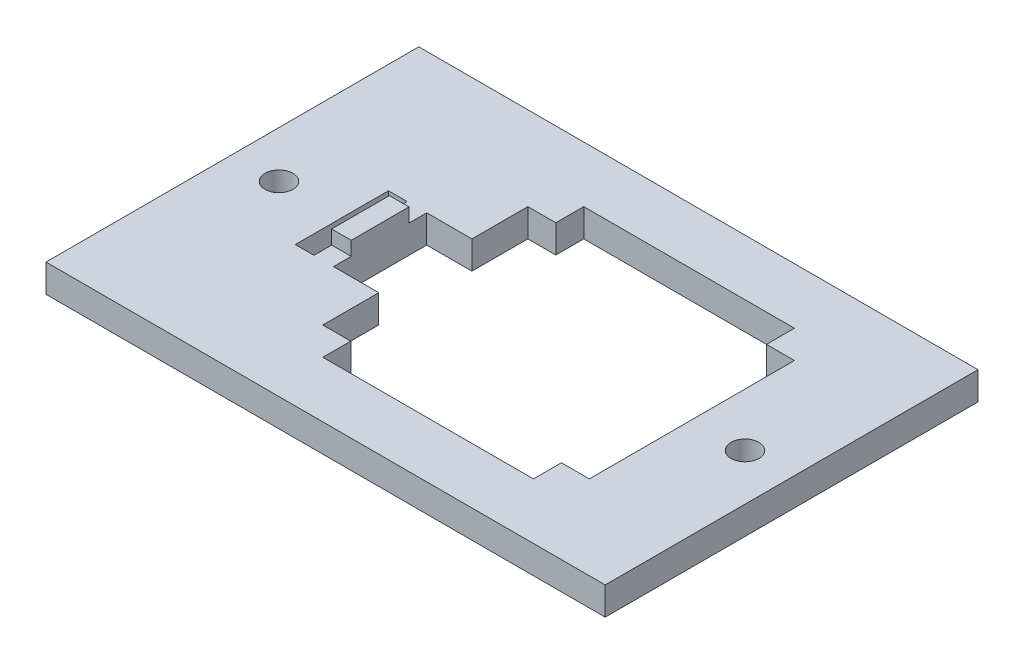
ISO-10303-21;
HEADER;
FILE_DESCRIPTION(('STEP AP214'),'2;1');
FILE_NAME('part.step','',(''),(''),'','','');
FILE_SCHEMA(('AUTOMOTIVE_DESIGN { 1 0 10303 214 1 1 1 1 }'));
ENDSEC;
DATA;
#1=APPLICATION_CONTEXT('core data for automotive mechanical design processes');
#2=APPLICATION_PROTOCOL_DEFINITION('international standard','automotive_design',2000,#1);
#3=PRODUCT_CONTEXT('',#1,'mechanical');
#4=PRODUCT('Part','Part','',(#3));
#5=PRODUCT_RELATED_PRODUCT_CATEGORY('part','',(#4));
#6=PRODUCT_DEFINITION_FORMATION('','',#4);
#7=PRODUCT_DEFINITION_CONTEXT('part definition',#1,'design');
#8=PRODUCT_DEFINITION('design','',#6,#7);
#9=PRODUCT_DEFINITION_SHAPE('','',#8);
#10=(LENGTH_UNIT() NAMED_UNIT(*) SI_UNIT(.MILLI.,.METRE.));
#11=(NAMED_UNIT(*) PLANE_ANGLE_UNIT() SI_UNIT($,.RADIAN.));
#12=(NAMED_UNIT(*) SI_UNIT($,.STERADIAN.) SOLID_ANGLE_UNIT());
#13=UNCERTAINTY_MEASURE_WITH_UNIT(LENGTH_MEASURE(1.E-05),#10,'distance_accuracy_value','');
#14=(GEOMETRIC_REPRESENTATION_CONTEXT(3) GLOBAL_UNCERTAINTY_ASSIGNED_CONTEXT((#13)) GLOBAL_UNIT_ASSIGNED_CONTEXT((#10,
#11,#12)) REPRESENTATION_CONTEXT('',''));
#15=CARTESIAN_POINT('',(0.,0.,0.));
#16=DIRECTION('',(0.,0.,1.));
#17=DIRECTION('',(1.,0.,0.));
#18=AXIS2_PLACEMENT_3D('',#15,#16,#17);
#19=CARTESIAN_POINT('',(-9.3,-0.00100000000000013,14.));
#20=DIRECTION('',(-1.,0.,0.));
#21=DIRECTION('',(0.,0.,1.));
#22=AXIS2_PLACEMENT_3D('',#19,#20,#21);
#23=PLANE('',#22);
#24=DIRECTION('',(0.,1.,0.));
#25=VECTOR('',#24,1.);
#26=CARTESIAN_POINT('',(-9.3,-0.00100000000000187,-5.));
#27=LINE('',#26,#25);
#28=CARTESIAN_POINT('',(-9.3,0.,-5.));
#29=VERTEX_POINT('',#28);
#30=CARTESIAN_POINT('',(-9.3,3.,-5.));
#31=VERTEX_POINT('',#30);
#32=EDGE_CURVE('E275',#29,#31,#27,.T.);
#33=ORIENTED_EDGE('',*,*,#32,.F.);
#34=DIRECTION('',(0.,0.,-1.));
#35=VECTOR('',#34,1.);
#36=CARTESIAN_POINT('',(-9.3,0.,14.));
#37=LINE('',#36,#35);
#38=CARTESIAN_POINT('',(-9.3,0.,-11.));
#39=VERTEX_POINT('',#38);
#40=EDGE_CURVE('E397',#29,#39,#37,.T.);
#41=ORIENTED_EDGE('',*,*,#40,.T.);
#42=DIRECTION('',(0.,1.,0.));
#43=VECTOR('',#42,1.);
#44=CARTESIAN_POINT('',(-9.3,-4.24264068711929,-11.));
#45=LINE('',#44,#43);
#46=CARTESIAN_POINT('',(-9.3,3.,-11.));
#47=VERTEX_POINT('',#46);
#48=EDGE_CURVE('E375',#39,#47,#45,.T.);
#49=ORIENTED_EDGE('',*,*,#48,.T.);
#50=DIRECTION('',(0.,0.,1.));
#51=VECTOR('',#50,1.);
#52=CARTESIAN_POINT('',(-9.3,3.,14.));
#53=LINE('',#52,#51);
#54=EDGE_CURVE('E402',#47,#31,#53,.T.);
#55=ORIENTED_EDGE('',*,*,#54,.T.);
#56=EDGE_LOOP('',(#33,#41,#49,#55));
#57=FACE_BOUND('',#56,.T.);
#58=ADVANCED_FACE('F39',(#57),#23,.F.);
#59=CARTESIAN_POINT('',(0.,0.,0.));
#60=DIRECTION('',(0.,1.,0.));
#61=DIRECTION('',(0.,0.,1.));
#62=AXIS2_PLACEMENT_3D('',#59,#60,#61);
#63=PLANE('',#62);
#64=DIRECTION('',(0.,0.,1.));
#65=VECTOR('',#64,1.);
#66=CARTESIAN_POINT('',(-30.,0.,20.));
#67=LINE('',#66,#65);
#68=CARTESIAN_POINT('',(-30.,0.,-20.));
#69=VERTEX_POINT('',#68);
#70=CARTESIAN_POINT('',(-30.,0.,20.));
#71=VERTEX_POINT('',#70);
#72=EDGE_CURVE('E414',#69,#71,#67,.T.);
#73=ORIENTED_EDGE('',*,*,#72,.F.);
#74=DIRECTION('',(-1.,0.,0.));
#75=VECTOR('',#74,1.);
#76=CARTESIAN_POINT('',(30.,0.,-20.));
#77=LINE('',#76,#75);
#78=CARTESIAN_POINT('',(30.,0.,-20.));
#79=VERTEX_POINT('',#78);
#80=EDGE_CURVE('E416',#79,#69,#77,.T.);
#81=ORIENTED_EDGE('',*,*,#80,.F.);
#82=DIRECTION('',(0.,0.,-1.));
#83=VECTOR('',#82,1.);
#84=CARTESIAN_POINT('',(30.,0.,20.));
#85=LINE('',#84,#83);
#86=CARTESIAN_POINT('',(30.,0.,20.));
#87=VERTEX_POINT('',#86);
#88=EDGE_CURVE('E427',#87,#79,#85,.T.);
#89=ORIENTED_EDGE('',*,*,#88,.F.);
#90=DIRECTION('',(1.,0.,0.));
#91=VECTOR('',#90,1.);
#92=CARTESIAN_POINT('',(30.,0.,20.));
#93=LINE('',#92,#91);
#94=EDGE_CURVE('E430',#71,#87,#93,.T.);
#95=ORIENTED_EDGE('',*,*,#94,.F.);
#96=EDGE_LOOP('',(#73,#81,#89,#95));
#97=FACE_BOUND('',#96,.T.);
#98=CARTESIAN_POINT('',(-25.,0.,0.));
#99=DIRECTION('',(0.,1.,0.));
#100=DIRECTION('',(0.,0.,1.));
#101=AXIS2_PLACEMENT_3D('',#98,#99,#100);
#102=CIRCLE('',#101,1.5);
#103=CARTESIAN_POINT('',(-25.,0.,1.5));
#104=VERTEX_POINT('',#103);
#105=EDGE_CURVE('E379',#104,#104,#102,.F.);
#106=ORIENTED_EDGE('',*,*,#105,.F.);
#107=EDGE_LOOP('',(#106));
#108=FACE_BOUND('',#107,.T.);
#109=CARTESIAN_POINT('',(25.,0.,0.));
#110=DIRECTION('',(0.,1.,0.));
#111=DIRECTION('',(0.,0.,1.));
#112=AXIS2_PLACEMENT_3D('',#109,#110,#111);
#113=CIRCLE('',#112,1.5);
#114=CARTESIAN_POINT('',(25.,0.,1.5));
#115=VERTEX_POINT('',#114);
#116=EDGE_CURVE('E383',#115,#115,#113,.F.);
#117=ORIENTED_EDGE('',*,*,#116,.F.);
#118=EDGE_LOOP('',(#117));
#119=FACE_BOUND('',#118,.T.);
#120=DIRECTION('',(0.,0.,1.));
#121=VECTOR('',#120,1.);
#122=CARTESIAN_POINT('',(-16.25,0.,-5.));
#123=LINE('',#122,#121);
#124=CARTESIAN_POINT('',(-16.25,0.,-5.));
#125=VERTEX_POINT('',#124);
#126=CARTESIAN_POINT('',(-16.25,0.,5.));
#127=VERTEX_POINT('',#126);
#128=EDGE_CURVE('E308',#125,#127,#123,.T.);
#129=ORIENTED_EDGE('',*,*,#128,.F.);
#130=DIRECTION('',(1.,0.,0.));
#131=VECTOR('',#130,1.);
#132=CARTESIAN_POINT('',(-16.25,0.,-5.));
#133=LINE('',#132,#131);
#134=CARTESIAN_POINT('',(-18.25,0.,-5.));
#135=VERTEX_POINT('',#134);
#136=EDGE_CURVE('E304',#135,#125,#133,.T.);
#137=ORIENTED_EDGE('',*,*,#136,.F.);
#138=DIRECTION('',(0.,0.,-1.));
#139=VECTOR('',#138,1.);
#140=CARTESIAN_POINT('',(-18.25,0.,5.));
#141=LINE('',#140,#139);
#142=CARTESIAN_POINT('',(-18.25,0.,5.));
#143=VERTEX_POINT('',#142);
#144=EDGE_CURVE('E249',#143,#135,#141,.T.);
#145=ORIENTED_EDGE('',*,*,#144,.F.);
#146=DIRECTION('',(-1.,0.,0.));
#147=VECTOR('',#146,1.);
#148=CARTESIAN_POINT('',(-16.25,0.,5.));
#149=LINE('',#148,#147);
#150=EDGE_CURVE('E261',#127,#143,#149,.T.);
#151=ORIENTED_EDGE('',*,*,#150,.F.);
#152=EDGE_LOOP('',(#129,#137,#145,#151));
#153=FACE_BOUND('',#152,.T.);
#154=DIRECTION('',(-1.,0.,0.));
#155=VECTOR('',#154,1.);
#156=CARTESIAN_POINT('',(-9.3,0.,5.));
#157=LINE('',#156,#155);
#158=CARTESIAN_POINT('',(-9.3,0.,5.));
#159=VERTEX_POINT('',#158);
#160=CARTESIAN_POINT('',(-14.15,0.,5.));
#161=VERTEX_POINT('',#160);
#162=EDGE_CURVE('E257',#159,#161,#157,.T.);
#163=ORIENTED_EDGE('',*,*,#162,.F.);
#164=CARTESIAN_POINT('',(-9.3,0.,11.));
#165=VERTEX_POINT('',#164);
#166=EDGE_CURVE('E400',#165,#159,#37,.T.);
#167=ORIENTED_EDGE('',*,*,#166,.F.);
#168=DIRECTION('',(1.,0.,0.));
#169=VECTOR('',#168,1.);
#170=CARTESIAN_POINT('',(-9.3,0.,11.));
#171=LINE('',#170,#169);
#172=CARTESIAN_POINT('',(-6.3,0.,11.));
#173=VERTEX_POINT('',#172);
#174=EDGE_CURVE('E324',#165,#173,#171,.T.);
#175=ORIENTED_EDGE('',*,*,#174,.T.);
#176=DIRECTION('',(0.,0.,1.));
#177=VECTOR('',#176,1.);
#178=CARTESIAN_POINT('',(-6.3,0.,14.));
#179=LINE('',#178,#177);
#180=CARTESIAN_POINT('',(-6.3,0.,14.));
#181=VERTEX_POINT('',#180);
#182=EDGE_CURVE('E318',#173,#181,#179,.T.);
#183=ORIENTED_EDGE('',*,*,#182,.T.);
#184=DIRECTION('',(-1.,0.,0.));
#185=VECTOR('',#184,1.);
#186=CARTESIAN_POINT('',(19.3,0.,14.));
#187=LINE('',#186,#185);
#188=CARTESIAN_POINT('',(16.3,0.,14.));
#189=VERTEX_POINT('',#188);
#190=EDGE_CURVE('E409',#189,#181,#187,.T.);
#191=ORIENTED_EDGE('',*,*,#190,.F.);
#192=DIRECTION('',(0.,0.,-1.));
#193=VECTOR('',#192,1.);
#194=CARTESIAN_POINT('',(16.3,0.,14.));
#195=LINE('',#194,#193);
#196=CARTESIAN_POINT('',(16.3,0.,11.));
#197=VERTEX_POINT('',#196);
#198=EDGE_CURVE('E335',#189,#197,#195,.T.);
#199=ORIENTED_EDGE('',*,*,#198,.T.);
#200=DIRECTION('',(1.,0.,0.));
#201=VECTOR('',#200,1.);
#202=CARTESIAN_POINT('',(19.3,0.,11.));
#203=LINE('',#202,#201);
#204=CARTESIAN_POINT('',(19.3,0.,11.));
#205=VERTEX_POINT('',#204);
#206=EDGE_CURVE('E328',#197,#205,#203,.T.);
#207=ORIENTED_EDGE('',*,*,#206,.T.);
#208=DIRECTION('',(0.,0.,1.));
#209=VECTOR('',#208,1.);
#210=CARTESIAN_POINT('',(19.3,0.,14.));
#211=LINE('',#210,#209);
#212=CARTESIAN_POINT('',(19.3,0.,-11.));
#213=VERTEX_POINT('',#212);
#214=EDGE_CURVE('E389',#213,#205,#211,.T.);
#215=ORIENTED_EDGE('',*,*,#214,.F.);
#216=DIRECTION('',(-1.,0.,0.));
#217=VECTOR('',#216,1.);
#218=CARTESIAN_POINT('',(19.3,0.,-11.));
#219=LINE('',#218,#217);
#220=CARTESIAN_POINT('',(16.3,0.,-11.));
#221=VERTEX_POINT('',#220);
#222=EDGE_CURVE('E282',#213,#221,#219,.T.);
#223=ORIENTED_EDGE('',*,*,#222,.T.);
#224=DIRECTION('',(0.,0.,-1.));
#225=VECTOR('',#224,1.);
#226=CARTESIAN_POINT('',(16.3,0.,-14.));
#227=LINE('',#226,#225);
#228=CARTESIAN_POINT('',(16.3,0.,-14.));
#229=VERTEX_POINT('',#228);
#230=EDGE_CURVE('E354',#221,#229,#227,.T.);
#231=ORIENTED_EDGE('',*,*,#230,.T.);
#232=DIRECTION('',(1.,0.,0.));
#233=VECTOR('',#232,1.);
#234=CARTESIAN_POINT('',(19.3,0.,-14.));
#235=LINE('',#234,#233);
#236=CARTESIAN_POINT('',(-6.3,0.,-14.));
#237=VERTEX_POINT('',#236);
#238=EDGE_CURVE('E393',#237,#229,#235,.T.);
#239=ORIENTED_EDGE('',*,*,#238,.F.);
#240=DIRECTION('',(0.,0.,1.));
#241=VECTOR('',#240,1.);
#242=CARTESIAN_POINT('',(-6.3,0.,-14.));
#243=LINE('',#242,#241);
#244=CARTESIAN_POINT('',(-6.3,0.,-11.));
#245=VERTEX_POINT('',#244);
#246=EDGE_CURVE('E361',#237,#245,#243,.T.);
#247=ORIENTED_EDGE('',*,*,#246,.T.);
#248=DIRECTION('',(-1.,0.,0.));
#249=VECTOR('',#248,1.);
#250=CARTESIAN_POINT('',(-9.3,0.,-11.));
#251=LINE('',#250,#249);
#252=EDGE_CURVE('E364',#245,#39,#251,.T.);
#253=ORIENTED_EDGE('',*,*,#252,.T.);
#254=ORIENTED_EDGE('',*,*,#40,.F.);
#255=DIRECTION('',(1.,0.,0.));
#256=VECTOR('',#255,1.);
#257=CARTESIAN_POINT('',(-9.3,0.,-5.));
#258=LINE('',#257,#256);
#259=CARTESIAN_POINT('',(-14.15,0.,-5.));
#260=VERTEX_POINT('',#259);
#261=EDGE_CURVE('E277',#260,#29,#258,.T.);
#262=ORIENTED_EDGE('',*,*,#261,.F.);
#263=DIRECTION('',(0.,0.,-1.));
#264=VECTOR('',#263,1.);
#265=CARTESIAN_POINT('',(-14.15,0.,-5.));
#266=LINE('',#265,#264);
#267=EDGE_CURVE('E260',#161,#260,#266,.T.);
#268=ORIENTED_EDGE('',*,*,#267,.F.);
#269=EDGE_LOOP('',(#163,#167,#175,#183,#191,#199,#207,#215,#223,#231,#239,#247,#253,#254,#262,#268));
#270=FACE_BOUND('',#269,.T.);
#271=ADVANCED_FACE('F450',(#97,#108,#119,#153,#270),#63,.F.);
#272=ORIENTED_EDGE('',*,*,#166,.T.);
#273=DIRECTION('',(0.,1.,0.));
#274=VECTOR('',#273,1.);
#275=CARTESIAN_POINT('',(-9.3,-0.00100000000000187,5.));
#276=LINE('',#275,#274);
#277=CARTESIAN_POINT('',(-9.3,3.,5.));
#278=VERTEX_POINT('',#277);
#279=EDGE_CURVE('E272',#159,#278,#276,.T.);
#280=ORIENTED_EDGE('',*,*,#279,.T.);
#281=CARTESIAN_POINT('',(-9.3,3.,11.));
#282=VERTEX_POINT('',#281);
#283=EDGE_CURVE('E398',#278,#282,#53,.T.);
#284=ORIENTED_EDGE('',*,*,#283,.T.);
#285=DIRECTION('',(0.,1.,0.));
#286=VECTOR('',#285,1.);
#287=CARTESIAN_POINT('',(-9.3,-4.24264068711929,11.));
#288=LINE('',#287,#286);
#289=EDGE_CURVE('E312',#165,#282,#288,.T.);
#290=ORIENTED_EDGE('',*,*,#289,.F.);
#291=EDGE_LOOP('',(#272,#280,#284,#290));
#292=FACE_BOUND('',#291,.T.);
#293=ADVANCED_FACE('F466',(#292),#23,.F.);
#294=CARTESIAN_POINT('',(19.3,-0.00100000000000013,-14.));
#295=DIRECTION('',(0.,0.,-1.));
#296=DIRECTION('',(-1.,0.,0.));
#297=AXIS2_PLACEMENT_3D('',#294,#295,#296);
#298=PLANE('',#297);
#299=ORIENTED_EDGE('',*,*,#238,.T.);
#300=DIRECTION('',(0.,1.,0.));
#301=VECTOR('',#300,1.);
#302=CARTESIAN_POINT('',(16.3,-4.24264068711929,-14.));
#303=LINE('',#302,#301);
#304=CARTESIAN_POINT('',(16.3,3.,-14.));
#305=VERTEX_POINT('',#304);
#306=EDGE_CURVE('E350',#229,#305,#303,.T.);
#307=ORIENTED_EDGE('',*,*,#306,.T.);
#308=DIRECTION('',(-1.,0.,0.));
#309=VECTOR('',#308,1.);
#310=CARTESIAN_POINT('',(19.3,3.,-14.));
#311=LINE('',#310,#309);
#312=CARTESIAN_POINT('',(-6.3,3.,-14.));
#313=VERTEX_POINT('',#312);
#314=EDGE_CURVE('E407',#305,#313,#311,.T.);
#315=ORIENTED_EDGE('',*,*,#314,.T.);
#316=DIRECTION('',(0.,1.,0.));
#317=VECTOR('',#316,1.);
#318=CARTESIAN_POINT('',(-6.3,-4.24264068711929,-14.));
#319=LINE('',#318,#317);
#320=EDGE_CURVE('E368',#237,#313,#319,.T.);
#321=ORIENTED_EDGE('',*,*,#320,.F.);
#322=EDGE_LOOP('',(#299,#307,#315,#321));
#323=FACE_BOUND('',#322,.T.);
#324=ADVANCED_FACE('F479',(#323),#298,.F.);
#325=CARTESIAN_POINT('',(19.3,-0.00100000000000013,14.));
#326=DIRECTION('',(1.,0.,0.));
#327=DIRECTION('',(0.,0.,-1.));
#328=AXIS2_PLACEMENT_3D('',#325,#326,#327);
#329=PLANE('',#328);
#330=DIRECTION('',(0.,1.,0.));
#331=VECTOR('',#330,1.);
#332=CARTESIAN_POINT('',(19.3,-4.24264068711929,-11.));
#333=LINE('',#332,#331);
#334=CARTESIAN_POINT('',(19.3,3.,-11.));
#335=VERTEX_POINT('',#334);
#336=EDGE_CURVE('E355',#213,#335,#333,.T.);
#337=ORIENTED_EDGE('',*,*,#336,.F.);
#338=ORIENTED_EDGE('',*,*,#214,.T.);
#339=DIRECTION('',(0.,1.,0.));
#340=VECTOR('',#339,1.);
#341=CARTESIAN_POINT('',(19.3,-4.24264068711929,11.));
#342=LINE('',#341,#340);
#343=CARTESIAN_POINT('',(19.3,3.,11.));
#344=VERTEX_POINT('',#343);
#345=EDGE_CURVE('E331',#205,#344,#342,.T.);
#346=ORIENTED_EDGE('',*,*,#345,.T.);
#347=DIRECTION('',(0.,0.,-1.));
#348=VECTOR('',#347,1.);
#349=CARTESIAN_POINT('',(19.3,3.,14.));
#350=LINE('',#349,#348);
#351=EDGE_CURVE('E406',#344,#335,#350,.T.);
#352=ORIENTED_EDGE('',*,*,#351,.T.);
#353=EDGE_LOOP('',(#337,#338,#346,#352));
#354=FACE_BOUND('',#353,.T.);
#355=ADVANCED_FACE('F484',(#354),#329,.F.);
#356=CARTESIAN_POINT('',(19.3,-0.00100000000000013,14.));
#357=DIRECTION('',(0.,0.,1.));
#358=DIRECTION('',(1.,0.,0.));
#359=AXIS2_PLACEMENT_3D('',#356,#357,#358);
#360=PLANE('',#359);
#361=DIRECTION('',(0.,1.,0.));
#362=VECTOR('',#361,1.);
#363=CARTESIAN_POINT('',(16.3,-4.24264068711929,14.));
#364=LINE('',#363,#362);
#365=CARTESIAN_POINT('',(16.3,3.,14.));
#366=VERTEX_POINT('',#365);
#367=EDGE_CURVE('E338',#189,#366,#364,.T.);
#368=ORIENTED_EDGE('',*,*,#367,.F.);
#369=ORIENTED_EDGE('',*,*,#190,.T.);
#370=DIRECTION('',(0.,1.,0.));
#371=VECTOR('',#370,1.);
#372=CARTESIAN_POINT('',(-6.3,-4.24264068711929,14.));
#373=LINE('',#372,#371);
#374=CARTESIAN_POINT('',(-6.3,3.,14.));
#375=VERTEX_POINT('',#374);
#376=EDGE_CURVE('E310',#181,#375,#373,.T.);
#377=ORIENTED_EDGE('',*,*,#376,.T.);
#378=DIRECTION('',(1.,0.,0.));
#379=VECTOR('',#378,1.);
#380=CARTESIAN_POINT('',(19.3,3.,14.));
#381=LINE('',#380,#379);
#382=EDGE_CURVE('E404',#375,#366,#381,.T.);
#383=ORIENTED_EDGE('',*,*,#382,.T.);
#384=EDGE_LOOP('',(#368,#369,#377,#383));
#385=FACE_BOUND('',#384,.T.);
#386=ADVANCED_FACE('F464',(#385),#360,.F.);
#387=CARTESIAN_POINT('',(-30.,3.,20.));
#388=DIRECTION('',(1.,0.,0.));
#389=DIRECTION('',(0.,0.,-1.));
#390=AXIS2_PLACEMENT_3D('',#387,#388,#389);
#391=PLANE('',#390);
#392=ORIENTED_EDGE('',*,*,#72,.T.);
#393=DIRECTION('',(0.,-1.,0.));
#394=VECTOR('',#393,1.);
#395=CARTESIAN_POINT('',(-30.,3.,20.));
#396=LINE('',#395,#394);
#397=CARTESIAN_POINT('',(-30.,3.,20.));
#398=VERTEX_POINT('',#397);
#399=EDGE_CURVE('E11',#398,#71,#396,.T.);
#400=ORIENTED_EDGE('',*,*,#399,.F.);
#401=DIRECTION('',(0.,0.,1.));
#402=VECTOR('',#401,1.);
#403=CARTESIAN_POINT('',(-30.,3.,20.));
#404=LINE('',#403,#402);
#405=CARTESIAN_POINT('',(-30.,3.,-20.));
#406=VERTEX_POINT('',#405);
#407=EDGE_CURVE('E411',#406,#398,#404,.T.);
#408=ORIENTED_EDGE('',*,*,#407,.F.);
#409=DIRECTION('',(0.,-1.,0.));
#410=VECTOR('',#409,1.);
#411=CARTESIAN_POINT('',(-30.,3.,-20.));
#412=LINE('',#411,#410);
#413=EDGE_CURVE('E424',#406,#69,#412,.T.);
#414=ORIENTED_EDGE('',*,*,#413,.T.);
#415=EDGE_LOOP('',(#392,#400,#408,#414));
#416=FACE_BOUND('',#415,.T.);
#417=ADVANCED_FACE('F41',(#416),#391,.F.);
#418=CARTESIAN_POINT('',(30.,3.,20.));
#419=DIRECTION('',(0.,0.,-1.));
#420=DIRECTION('',(-1.,0.,0.));
#421=AXIS2_PLACEMENT_3D('',#418,#419,#420);
#422=PLANE('',#421);
#423=ORIENTED_EDGE('',*,*,#94,.T.);
#424=DIRECTION('',(0.,-1.,0.));
#425=VECTOR('',#424,1.);
#426=CARTESIAN_POINT('',(30.,3.,20.));
#427=LINE('',#426,#425);
#428=CARTESIAN_POINT('',(30.,3.,20.));
#429=VERTEX_POINT('',#428);
#430=EDGE_CURVE('E50',#429,#87,#427,.T.);
#431=ORIENTED_EDGE('',*,*,#430,.F.);
#432=DIRECTION('',(1.,0.,0.));
#433=VECTOR('',#432,1.);
#434=CARTESIAN_POINT('',(30.,3.,20.));
#435=LINE('',#434,#433);
#436=EDGE_CURVE('E417',#398,#429,#435,.T.);
#437=ORIENTED_EDGE('',*,*,#436,.F.);
#438=ORIENTED_EDGE('',*,*,#399,.T.);
#439=EDGE_LOOP('',(#423,#431,#437,#438));
#440=FACE_BOUND('',#439,.T.);
#441=ADVANCED_FACE('F456',(#440),#422,.F.);
#442=CARTESIAN_POINT('',(30.,3.,20.));
#443=DIRECTION('',(-1.,0.,0.));
#444=DIRECTION('',(0.,0.,1.));
#445=AXIS2_PLACEMENT_3D('',#442,#443,#444);
#446=PLANE('',#445);
#447=ORIENTED_EDGE('',*,*,#88,.T.);
#448=DIRECTION('',(0.,-1.,0.));
#449=VECTOR('',#448,1.);
#450=CARTESIAN_POINT('',(30.,3.,-20.));
#451=LINE('',#450,#449);
#452=CARTESIAN_POINT('',(30.,3.,-20.));
#453=VERTEX_POINT('',#452);
#454=EDGE_CURVE('E432',#453,#79,#451,.T.);
#455=ORIENTED_EDGE('',*,*,#454,.F.);
#456=DIRECTION('',(0.,0.,-1.));
#457=VECTOR('',#456,1.);
#458=CARTESIAN_POINT('',(30.,3.,20.));
#459=LINE('',#458,#457);
#460=EDGE_CURVE('E419',#429,#453,#459,.T.);
#461=ORIENTED_EDGE('',*,*,#460,.F.);
#462=ORIENTED_EDGE('',*,*,#430,.T.);
#463=EDGE_LOOP('',(#447,#455,#461,#462));
#464=FACE_BOUND('',#463,.T.);
#465=ADVANCED_FACE('F442',(#464),#446,.F.);
#466=CARTESIAN_POINT('',(30.,3.,-20.));
#467=DIRECTION('',(0.,0.,1.));
#468=DIRECTION('',(1.,0.,0.));
#469=AXIS2_PLACEMENT_3D('',#466,#467,#468);
#470=PLANE('',#469);
#471=ORIENTED_EDGE('',*,*,#80,.T.);
#472=ORIENTED_EDGE('',*,*,#413,.F.);
#473=DIRECTION('',(-1.,0.,0.));
#474=VECTOR('',#473,1.);
#475=CARTESIAN_POINT('',(30.,3.,-20.));
#476=LINE('',#475,#474);
#477=EDGE_CURVE('E425',#453,#406,#476,.T.);
#478=ORIENTED_EDGE('',*,*,#477,.F.);
#479=ORIENTED_EDGE('',*,*,#454,.T.);
#480=EDGE_LOOP('',(#471,#472,#478,#479));
#481=FACE_BOUND('',#480,.T.);
#482=ADVANCED_FACE('F452',(#481),#470,.F.);
#483=CARTESIAN_POINT('',(0.,3.,0.));
#484=DIRECTION('',(0.,1.,0.));
#485=DIRECTION('',(0.,0.,1.));
#486=AXIS2_PLACEMENT_3D('',#483,#484,#485);
#487=PLANE('',#486);
#488=DIRECTION('',(-1.,0.,0.));
#489=VECTOR('',#488,1.);
#490=CARTESIAN_POINT('',(-16.25,3.,-3.1));
#491=LINE('',#490,#489);
#492=CARTESIAN_POINT('',(-14.15,3.,-3.1));
#493=VERTEX_POINT('',#492);
#494=CARTESIAN_POINT('',(-16.25,3.,-3.1));
#495=VERTEX_POINT('',#494);
#496=EDGE_CURVE('E242',#493,#495,#491,.T.);
#497=ORIENTED_EDGE('',*,*,#496,.F.);
#498=DIRECTION('',(0.,0.,1.));
#499=VECTOR('',#498,1.);
#500=CARTESIAN_POINT('',(-14.15,3.,-5.));
#501=LINE('',#500,#499);
#502=CARTESIAN_POINT('',(-14.15,3.,-5.));
#503=VERTEX_POINT('',#502);
#504=EDGE_CURVE('E270',#503,#493,#501,.T.);
#505=ORIENTED_EDGE('',*,*,#504,.F.);
#506=DIRECTION('',(-1.,0.,0.));
#507=VECTOR('',#506,1.);
#508=CARTESIAN_POINT('',(-9.3,3.,-5.));
#509=LINE('',#508,#507);
#510=EDGE_CURVE('E263',#31,#503,#509,.T.);
#511=ORIENTED_EDGE('',*,*,#510,.F.);
#512=ORIENTED_EDGE('',*,*,#54,.F.);
#513=DIRECTION('',(1.,0.,0.));
#514=VECTOR('',#513,1.);
#515=CARTESIAN_POINT('',(-9.3,3.,-11.));
#516=LINE('',#515,#514);
#517=CARTESIAN_POINT('',(-6.3,3.,-11.));
#518=VERTEX_POINT('',#517);
#519=EDGE_CURVE('E322',#47,#518,#516,.T.);
#520=ORIENTED_EDGE('',*,*,#519,.T.);
#521=DIRECTION('',(0.,0.,-1.));
#522=VECTOR('',#521,1.);
#523=CARTESIAN_POINT('',(-6.3,3.,-14.));
#524=LINE('',#523,#522);
#525=EDGE_CURVE('E369',#518,#313,#524,.T.);
#526=ORIENTED_EDGE('',*,*,#525,.T.);
#527=ORIENTED_EDGE('',*,*,#314,.F.);
#528=DIRECTION('',(0.,0.,1.));
#529=VECTOR('',#528,1.);
#530=CARTESIAN_POINT('',(16.3,3.,-14.));
#531=LINE('',#530,#529);
#532=CARTESIAN_POINT('',(16.3,3.,-11.));
#533=VERTEX_POINT('',#532);
#534=EDGE_CURVE('E334',#305,#533,#531,.T.);
#535=ORIENTED_EDGE('',*,*,#534,.T.);
#536=DIRECTION('',(1.,0.,0.));
#537=VECTOR('',#536,1.);
#538=CARTESIAN_POINT('',(19.3,3.,-11.));
#539=LINE('',#538,#537);
#540=EDGE_CURVE('E349',#533,#335,#539,.T.);
#541=ORIENTED_EDGE('',*,*,#540,.T.);
#542=ORIENTED_EDGE('',*,*,#351,.F.);
#543=DIRECTION('',(-1.,0.,0.));
#544=VECTOR('',#543,1.);
#545=CARTESIAN_POINT('',(19.3,3.,11.));
#546=LINE('',#545,#544);
#547=CARTESIAN_POINT('',(16.3,3.,11.));
#548=VERTEX_POINT('',#547);
#549=EDGE_CURVE('E330',#344,#548,#546,.T.);
#550=ORIENTED_EDGE('',*,*,#549,.T.);
#551=DIRECTION('',(0.,0.,1.));
#552=VECTOR('',#551,1.);
#553=CARTESIAN_POINT('',(16.3,3.,14.));
#554=LINE('',#553,#552);
#555=EDGE_CURVE('E336',#548,#366,#554,.T.);
#556=ORIENTED_EDGE('',*,*,#555,.T.);
#557=ORIENTED_EDGE('',*,*,#382,.F.);
#558=DIRECTION('',(0.,0.,-1.));
#559=VECTOR('',#558,1.);
#560=CARTESIAN_POINT('',(-6.3,3.,14.));
#561=LINE('',#560,#559);
#562=CARTESIAN_POINT('',(-6.3,3.,11.));
#563=VERTEX_POINT('',#562);
#564=EDGE_CURVE('E321',#375,#563,#561,.T.);
#565=ORIENTED_EDGE('',*,*,#564,.T.);
#566=DIRECTION('',(-1.,0.,0.));
#567=VECTOR('',#566,1.);
#568=CARTESIAN_POINT('',(-9.3,3.,11.));
#569=LINE('',#568,#567);
#570=EDGE_CURVE('E315',#563,#282,#569,.T.);
#571=ORIENTED_EDGE('',*,*,#570,.T.);
#572=ORIENTED_EDGE('',*,*,#283,.F.);
#573=DIRECTION('',(1.,0.,0.));
#574=VECTOR('',#573,1.);
#575=CARTESIAN_POINT('',(-9.3,3.,5.));
#576=LINE('',#575,#574);
#577=CARTESIAN_POINT('',(-14.15,3.,5.));
#578=VERTEX_POINT('',#577);
#579=EDGE_CURVE('E269',#578,#278,#576,.T.);
#580=ORIENTED_EDGE('',*,*,#579,.F.);
#581=CARTESIAN_POINT('',(-14.15,3.,3.1));
#582=VERTEX_POINT('',#581);
#583=EDGE_CURVE('E266',#582,#578,#501,.T.);
#584=ORIENTED_EDGE('',*,*,#583,.F.);
#585=DIRECTION('',(1.,0.,0.));
#586=VECTOR('',#585,1.);
#587=CARTESIAN_POINT('',(-16.25,3.,3.1));
#588=LINE('',#587,#586);
#589=CARTESIAN_POINT('',(-16.25,3.,3.1));
#590=VERTEX_POINT('',#589);
#591=EDGE_CURVE('E61',#590,#582,#588,.T.);
#592=ORIENTED_EDGE('',*,*,#591,.F.);
#593=DIRECTION('',(0.,0.,-1.));
#594=VECTOR('',#593,1.);
#595=CARTESIAN_POINT('',(-16.25,3.,-5.));
#596=LINE('',#595,#594);
#597=CARTESIAN_POINT('',(-16.25,3.,5.));
#598=VERTEX_POINT('',#597);
#599=EDGE_CURVE('E250',#598,#590,#596,.T.);
#600=ORIENTED_EDGE('',*,*,#599,.F.);
#601=DIRECTION('',(1.,0.,0.));
#602=VECTOR('',#601,1.);
#603=CARTESIAN_POINT('',(-16.25,3.,5.));
#604=LINE('',#603,#602);
#605=CARTESIAN_POINT('',(-18.25,3.,5.));
#606=VERTEX_POINT('',#605);
#607=EDGE_CURVE('E293',#606,#598,#604,.T.);
#608=ORIENTED_EDGE('',*,*,#607,.F.);
#609=DIRECTION('',(0.,0.,1.));
#610=VECTOR('',#609,1.);
#611=CARTESIAN_POINT('',(-18.25,3.,5.));
#612=LINE('',#611,#610);
#613=CARTESIAN_POINT('',(-18.25,3.,-5.));
#614=VERTEX_POINT('',#613);
#615=EDGE_CURVE('E297',#614,#606,#612,.T.);
#616=ORIENTED_EDGE('',*,*,#615,.F.);
#617=DIRECTION('',(-1.,0.,0.));
#618=VECTOR('',#617,1.);
#619=CARTESIAN_POINT('',(-16.25,3.,-5.));
#620=LINE('',#619,#618);
#621=CARTESIAN_POINT('',(-16.25,3.,-5.));
#622=VERTEX_POINT('',#621);
#623=EDGE_CURVE('E302',#622,#614,#620,.T.);
#624=ORIENTED_EDGE('',*,*,#623,.F.);
#625=EDGE_CURVE('E53',#495,#622,#596,.T.);
#626=ORIENTED_EDGE('',*,*,#625,.F.);
#627=EDGE_LOOP('',(#497,#505,#511,#512,#520,#526,#527,#535,#541,#542,#550,#556,#557,#565,#571,
#572,#580,#584,#592,#600,#608,#616,#624,#626));
#628=FACE_BOUND('',#627,.T.);
#629=CARTESIAN_POINT('',(25.,3.,0.));
#630=DIRECTION('',(0.,1.,0.));
#631=DIRECTION('',(0.,0.,1.));
#632=AXIS2_PLACEMENT_3D('',#629,#630,#631);
#633=CIRCLE('',#632,1.5);
#634=CARTESIAN_POINT('',(25.,3.,1.5));
#635=VERTEX_POINT('',#634);
#636=EDGE_CURVE('E381',#635,#635,#633,.T.);
#637=ORIENTED_EDGE('',*,*,#636,.F.);
#638=EDGE_LOOP('',(#637));
#639=FACE_BOUND('',#638,.T.);
#640=CARTESIAN_POINT('',(-25.,3.,0.));
#641=DIRECTION('',(0.,1.,0.));
#642=DIRECTION('',(0.,0.,1.));
#643=AXIS2_PLACEMENT_3D('',#640,#641,#642);
#644=CIRCLE('',#643,1.5);
#645=CARTESIAN_POINT('',(-25.,3.,1.5));
#646=VERTEX_POINT('',#645);
#647=EDGE_CURVE('E384',#646,#646,#644,.T.);
#648=ORIENTED_EDGE('',*,*,#647,.F.);
#649=EDGE_LOOP('',(#648));
#650=FACE_BOUND('',#649,.T.);
#651=ORIENTED_EDGE('',*,*,#407,.T.);
#652=ORIENTED_EDGE('',*,*,#436,.T.);
#653=ORIENTED_EDGE('',*,*,#460,.T.);
#654=ORIENTED_EDGE('',*,*,#477,.T.);
#655=EDGE_LOOP('',(#651,#652,#653,#654));
#656=FACE_BOUND('',#655,.T.);
#657=ADVANCED_FACE('F460',(#628,#639,#650,#656),#487,.T.);
#658=CARTESIAN_POINT('',(-25.,-0.00100000000000013,0.));
#659=DIRECTION('',(0.,1.,0.));
#660=DIRECTION('',(0.,0.,1.));
#661=AXIS2_PLACEMENT_3D('',#658,#659,#660);
#662=CYLINDRICAL_SURFACE('',#661,1.5);
#663=CARTESIAN_POINT('',(-25.,3.,1.5));
#664=CARTESIAN_POINT('',(-25.,2.96875,1.5));
#665=CARTESIAN_POINT('',(-25.,2.9375,1.5));
#666=CARTESIAN_POINT('',(-25.,2.875,1.5));
#667=CARTESIAN_POINT('',(-25.,2.84375,1.5));
#668=CARTESIAN_POINT('',(-25.,2.78125,1.5));
#669=CARTESIAN_POINT('',(-25.,2.75,1.5));
#670=CARTESIAN_POINT('',(-25.,2.6875,1.5));
#671=CARTESIAN_POINT('',(-25.,2.65625,1.5));
#672=CARTESIAN_POINT('',(-25.,2.59375,1.5));
#673=CARTESIAN_POINT('',(-25.,2.5625,1.5));
#674=CARTESIAN_POINT('',(-25.,2.5,1.5));
#675=CARTESIAN_POINT('',(-25.,2.46875,1.5));
#676=CARTESIAN_POINT('',(-25.,2.40625,1.5));
#677=CARTESIAN_POINT('',(-25.,2.375,1.5));
#678=CARTESIAN_POINT('',(-25.,2.3125,1.5));
#679=CARTESIAN_POINT('',(-25.,2.28125,1.5));
#680=CARTESIAN_POINT('',(-25.,2.21875,1.5));
#681=CARTESIAN_POINT('',(-25.,2.1875,1.5));
#682=CARTESIAN_POINT('',(-25.,2.125,1.5));
#683=CARTESIAN_POINT('',(-25.,2.09375,1.5));
#684=CARTESIAN_POINT('',(-25.,2.03125,1.5));
#685=CARTESIAN_POINT('',(-25.,2.,1.5));
#686=CARTESIAN_POINT('',(-25.,1.9375,1.5));
#687=CARTESIAN_POINT('',(-25.,1.90625,1.5));
#688=CARTESIAN_POINT('',(-25.,1.84375,1.5));
#689=CARTESIAN_POINT('',(-25.,1.8125,1.5));
#690=CARTESIAN_POINT('',(-25.,1.75,1.5));
#691=CARTESIAN_POINT('',(-25.,1.71875,1.5));
#692=CARTESIAN_POINT('',(-25.,1.65625,1.5));
#693=CARTESIAN_POINT('',(-25.,1.625,1.5));
#694=CARTESIAN_POINT('',(-25.,1.5625,1.5));
#695=CARTESIAN_POINT('',(-25.,1.53125,1.5));
#696=CARTESIAN_POINT('',(-25.,1.46875,1.5));
#697=CARTESIAN_POINT('',(-25.,1.4375,1.5));
#698=CARTESIAN_POINT('',(-25.,1.375,1.5));
#699=CARTESIAN_POINT('',(-25.,1.34375,1.5));
#700=CARTESIAN_POINT('',(-25.,1.28125,1.5));
#701=CARTESIAN_POINT('',(-25.,1.25,1.5));
#702=CARTESIAN_POINT('',(-25.,1.1875,1.5));
#703=CARTESIAN_POINT('',(-25.,1.15625,1.5));
#704=CARTESIAN_POINT('',(-25.,1.09375,1.5));
#705=CARTESIAN_POINT('',(-25.,1.0625,1.5));
#706=CARTESIAN_POINT('',(-25.,1.,1.5));
#707=CARTESIAN_POINT('',(-25.,0.96875,1.5));
#708=CARTESIAN_POINT('',(-25.,0.90625,1.5));
#709=CARTESIAN_POINT('',(-25.,0.875,1.5));
#710=CARTESIAN_POINT('',(-25.,0.8125,1.5));
#711=CARTESIAN_POINT('',(-25.,0.78125,1.5));
#712=CARTESIAN_POINT('',(-25.,0.71875,1.5));
#713=CARTESIAN_POINT('',(-25.,0.6875,1.5));
#714=CARTESIAN_POINT('',(-25.,0.625,1.5));
#715=CARTESIAN_POINT('',(-25.,0.59375,1.5));
#716=CARTESIAN_POINT('',(-25.,0.53125,1.5));
#717=CARTESIAN_POINT('',(-25.,0.5,1.5));
#718=CARTESIAN_POINT('',(-25.,0.4375,1.5));
#719=CARTESIAN_POINT('',(-25.,0.40625,1.5));
#720=CARTESIAN_POINT('',(-25.,0.34375,1.5));
#721=CARTESIAN_POINT('',(-25.,0.3125,1.5));
#722=CARTESIAN_POINT('',(-25.,0.25,1.5));
#723=CARTESIAN_POINT('',(-25.,0.21875,1.5));
#724=CARTESIAN_POINT('',(-25.,0.15625,1.5));
#725=CARTESIAN_POINT('',(-25.,0.125,1.5));
#726=CARTESIAN_POINT('',(-25.,0.0625000000000001,1.5));
#727=CARTESIAN_POINT('',(-25.,0.0312500000000001,1.5));
#728=CARTESIAN_POINT('',(-25.,0.,1.5));
#729=B_SPLINE_CURVE_WITH_KNOTS('',3,(#663,#664,#665,#666,#667,#668,#669,#670,#671,#672,#673,
#674,#675,#676,#677,#678,#679,#680,#681,#682,#683,#684,#685,#686,#687,#688,#689,#690,#691,#692,
#693,#694,#695,#696,#697,#698,#699,#700,#701,#702,#703,#704,#705,#706,#707,#708,#709,#710,#711,
#712,#713,#714,#715,#716,#717,#718,#719,#720,#721,#722,#723,#724,#725,#726,#727,#728),
.UNSPECIFIED.,.F.,.F.,(4,2,2,2,2,2,2,2,2,2,2,2,2,2,2,2,2,2,2,2,2,2,2,2,2,2,2,2,2,2,2,2,4),(0.,
0.0937500000000001,0.1875,0.28125,0.375,0.46875,0.5625,0.65625,0.75,0.84375,0.9375,1.03125,
1.125,1.21875,1.3125,1.40625,1.5,1.59375,1.6875,1.78125,1.875,1.96875,2.0625,2.15625,2.25,
2.34375,2.4375,2.53125,2.625,2.71875,2.8125,2.90625,3.),.UNSPECIFIED.);
#730=EDGE_CURVE('BSEAM575',#646,#104,#729,.T.);
#731=ORIENTED_EDGE('',*,*,#647,.T.);
#732=ORIENTED_EDGE('',*,*,#105,.T.);
#733=ORIENTED_EDGE('',*,*,#730,.T.);
#734=ORIENTED_EDGE('',*,*,#730,.F.);
#735=EDGE_LOOP('',(#731,#733,#732,#734));
#736=FACE_BOUND('',#735,.T.);
#737=ADVANCED_FACE('F575',(#736),#662,.F.);
#738=CARTESIAN_POINT('',(25.,-0.00100000000000013,0.));
#739=DIRECTION('',(0.,1.,0.));
#740=DIRECTION('',(0.,0.,1.));
#741=AXIS2_PLACEMENT_3D('',#738,#739,#740);
#742=CYLINDRICAL_SURFACE('',#741,1.5);
#743=CARTESIAN_POINT('',(25.,3.,1.5));
#744=CARTESIAN_POINT('',(25.,2.96875,1.5));
#745=CARTESIAN_POINT('',(25.,2.9375,1.5));
#746=CARTESIAN_POINT('',(25.,2.875,1.5));
#747=CARTESIAN_POINT('',(25.,2.84375,1.5));
#748=CARTESIAN_POINT('',(25.,2.78125,1.5));
#749=CARTESIAN_POINT('',(25.,2.75,1.5));
#750=CARTESIAN_POINT('',(25.,2.6875,1.5));
#751=CARTESIAN_POINT('',(25.,2.65625,1.5));
#752=CARTESIAN_POINT('',(25.,2.59375,1.5));
#753=CARTESIAN_POINT('',(25.,2.5625,1.5));
#754=CARTESIAN_POINT('',(25.,2.5,1.5));
#755=CARTESIAN_POINT('',(25.,2.46875,1.5));
#756=CARTESIAN_POINT('',(25.,2.40625,1.5));
#757=CARTESIAN_POINT('',(25.,2.375,1.5));
#758=CARTESIAN_POINT('',(25.,2.3125,1.5));
#759=CARTESIAN_POINT('',(25.,2.28125,1.5));
#760=CARTESIAN_POINT('',(25.,2.21875,1.5));
#761=CARTESIAN_POINT('',(25.,2.1875,1.5));
#762=CARTESIAN_POINT('',(25.,2.125,1.5));
#763=CARTESIAN_POINT('',(25.,2.09375,1.5));
#764=CARTESIAN_POINT('',(25.,2.03125,1.5));
#765=CARTESIAN_POINT('',(25.,2.,1.5));
#766=CARTESIAN_POINT('',(25.,1.9375,1.5));
#767=CARTESIAN_POINT('',(25.,1.90625,1.5));
#768=CARTESIAN_POINT('',(25.,1.84375,1.5));
#769=CARTESIAN_POINT('',(25.,1.8125,1.5));
#770=CARTESIAN_POINT('',(25.,1.75,1.5));
#771=CARTESIAN_POINT('',(25.,1.71875,1.5));
#772=CARTESIAN_POINT('',(25.,1.65625,1.5));
#773=CARTESIAN_POINT('',(25.,1.625,1.5));
#774=CARTESIAN_POINT('',(25.,1.5625,1.5));
#775=CARTESIAN_POINT('',(25.,1.53125,1.5));
#776=CARTESIAN_POINT('',(25.,1.46875,1.5));
#777=CARTESIAN_POINT('',(25.,1.4375,1.5));
#778=CARTESIAN_POINT('',(25.,1.375,1.5));
#779=CARTESIAN_POINT('',(25.,1.34375,1.5));
#780=CARTESIAN_POINT('',(25.,1.28125,1.5));
#781=CARTESIAN_POINT('',(25.,1.25,1.5));
#782=CARTESIAN_POINT('',(25.,1.1875,1.5));
#783=CARTESIAN_POINT('',(25.,1.15625,1.5));
#784=CARTESIAN_POINT('',(25.,1.09375,1.5));
#785=CARTESIAN_POINT('',(25.,1.0625,1.5));
#786=CARTESIAN_POINT('',(25.,1.,1.5));
#787=CARTESIAN_POINT('',(25.,0.96875,1.5));
#788=CARTESIAN_POINT('',(25.,0.90625,1.5));
#789=CARTESIAN_POINT('',(25.,0.875,1.5));
#790=CARTESIAN_POINT('',(25.,0.8125,1.5));
#791=CARTESIAN_POINT('',(25.,0.78125,1.5));
#792=CARTESIAN_POINT('',(25.,0.71875,1.5));
#793=CARTESIAN_POINT('',(25.,0.6875,1.5));
#794=CARTESIAN_POINT('',(25.,0.625,1.5));
#795=CARTESIAN_POINT('',(25.,0.59375,1.5));
#796=CARTESIAN_POINT('',(25.,0.53125,1.5));
#797=CARTESIAN_POINT('',(25.,0.5,1.5));
#798=CARTESIAN_POINT('',(25.,0.4375,1.5));
#799=CARTESIAN_POINT('',(25.,0.40625,1.5));
#800=CARTESIAN_POINT('',(25.,0.34375,1.5));
#801=CARTESIAN_POINT('',(25.,0.3125,1.5));
#802=CARTESIAN_POINT('',(25.,0.25,1.5));
#803=CARTESIAN_POINT('',(25.,0.21875,1.5));
#804=CARTESIAN_POINT('',(25.,0.15625,1.5));
#805=CARTESIAN_POINT('',(25.,0.125,1.5));
#806=CARTESIAN_POINT('',(25.,0.0625000000000001,1.5));
#807=CARTESIAN_POINT('',(25.,0.0312500000000001,1.5));
#808=CARTESIAN_POINT('',(25.,0.,1.5));
#809=B_SPLINE_CURVE_WITH_KNOTS('',3,(#743,#744,#745,#746,#747,#748,#749,#750,#751,#752,#753,
#754,#755,#756,#757,#758,#759,#760,#761,#762,#763,#764,#765,#766,#767,#768,#769,#770,#771,#772,
#773,#774,#775,#776,#777,#778,#779,#780,#781,#782,#783,#784,#785,#786,#787,#788,#789,#790,#791,
#792,#793,#794,#795,#796,#797,#798,#799,#800,#801,#802,#803,#804,#805,#806,#807,#808),
.UNSPECIFIED.,.F.,.F.,(4,2,2,2,2,2,2,2,2,2,2,2,2,2,2,2,2,2,2,2,2,2,2,2,2,2,2,2,2,2,2,2,4),(0.,
0.0937500000000001,0.1875,0.28125,0.375,0.46875,0.5625,0.65625,0.75,0.84375,0.9375,1.03125,
1.125,1.21875,1.3125,1.40625,1.5,1.59375,1.6875,1.78125,1.875,1.96875,2.0625,2.15625,2.25,
2.34375,2.4375,2.53125,2.625,2.71875,2.8125,2.90625,3.),.UNSPECIFIED.);
#810=EDGE_CURVE('BSEAM561',#635,#115,#809,.T.);
#811=ORIENTED_EDGE('',*,*,#636,.T.);
#812=ORIENTED_EDGE('',*,*,#116,.T.);
#813=ORIENTED_EDGE('',*,*,#810,.T.);
#814=ORIENTED_EDGE('',*,*,#810,.F.);
#815=EDGE_LOOP('',(#811,#813,#812,#814));
#816=FACE_BOUND('',#815,.T.);
#817=ADVANCED_FACE('F561',(#816),#742,.F.);
#818=CARTESIAN_POINT('',(-9.3,-4.24264068711929,11.));
#819=DIRECTION('',(0.,0.,-1.));
#820=DIRECTION('',(-1.,0.,0.));
#821=AXIS2_PLACEMENT_3D('',#818,#819,#820);
#822=PLANE('',#821);
#823=ORIENTED_EDGE('',*,*,#174,.F.);
#824=ORIENTED_EDGE('',*,*,#289,.T.);
#825=ORIENTED_EDGE('',*,*,#570,.F.);
#826=DIRECTION('',(0.,1.,0.));
#827=VECTOR('',#826,1.);
#828=CARTESIAN_POINT('',(-6.3,-4.24264068711929,11.));
#829=LINE('',#828,#827);
#830=EDGE_CURVE('E311',#173,#563,#829,.T.);
#831=ORIENTED_EDGE('',*,*,#830,.F.);
#832=EDGE_LOOP('',(#823,#824,#825,#831));
#833=FACE_BOUND('',#832,.T.);
#834=ADVANCED_FACE('F565',(#833),#822,.T.);
#835=CARTESIAN_POINT('',(-6.3,-4.24264068711929,14.));
#836=DIRECTION('',(1.,0.,0.));
#837=DIRECTION('',(0.,0.,-1.));
#838=AXIS2_PLACEMENT_3D('',#835,#836,#837);
#839=PLANE('',#838);
#840=ORIENTED_EDGE('',*,*,#182,.F.);
#841=ORIENTED_EDGE('',*,*,#830,.T.);
#842=ORIENTED_EDGE('',*,*,#564,.F.);
#843=ORIENTED_EDGE('',*,*,#376,.F.);
#844=EDGE_LOOP('',(#840,#841,#842,#843));
#845=FACE_BOUND('',#844,.T.);
#846=ADVANCED_FACE('F558',(#845),#839,.T.);
#847=CARTESIAN_POINT('',(16.3,-4.24264068711929,14.));
#848=DIRECTION('',(-1.,0.,0.));
#849=DIRECTION('',(0.,0.,1.));
#850=AXIS2_PLACEMENT_3D('',#847,#848,#849);
#851=PLANE('',#850);
#852=ORIENTED_EDGE('',*,*,#198,.F.);
#853=ORIENTED_EDGE('',*,*,#367,.T.);
#854=ORIENTED_EDGE('',*,*,#555,.F.);
#855=DIRECTION('',(0.,1.,0.));
#856=VECTOR('',#855,1.);
#857=CARTESIAN_POINT('',(16.3,-4.24264068711929,11.));
#858=LINE('',#857,#856);
#859=EDGE_CURVE('E340',#197,#548,#858,.T.);
#860=ORIENTED_EDGE('',*,*,#859,.F.);
#861=EDGE_LOOP('',(#852,#853,#854,#860));
#862=FACE_BOUND('',#861,.T.);
#863=ADVANCED_FACE('F551',(#862),#851,.T.);
#864=CARTESIAN_POINT('',(19.3,-4.24264068711929,11.));
#865=DIRECTION('',(0.,0.,-1.));
#866=DIRECTION('',(-1.,0.,0.));
#867=AXIS2_PLACEMENT_3D('',#864,#865,#866);
#868=PLANE('',#867);
#869=ORIENTED_EDGE('',*,*,#206,.F.);
#870=ORIENTED_EDGE('',*,*,#859,.T.);
#871=ORIENTED_EDGE('',*,*,#549,.F.);
#872=ORIENTED_EDGE('',*,*,#345,.F.);
#873=EDGE_LOOP('',(#869,#870,#871,#872));
#874=FACE_BOUND('',#873,.T.);
#875=ADVANCED_FACE('F549',(#874),#868,.T.);
#876=CARTESIAN_POINT('',(19.3,-4.24264068711929,-11.));
#877=DIRECTION('',(0.,0.,1.));
#878=DIRECTION('',(1.,0.,0.));
#879=AXIS2_PLACEMENT_3D('',#876,#877,#878);
#880=PLANE('',#879);
#881=ORIENTED_EDGE('',*,*,#222,.F.);
#882=ORIENTED_EDGE('',*,*,#336,.T.);
#883=ORIENTED_EDGE('',*,*,#540,.F.);
#884=DIRECTION('',(0.,1.,0.));
#885=VECTOR('',#884,1.);
#886=CARTESIAN_POINT('',(16.3,-4.24264068711929,-11.));
#887=LINE('',#886,#885);
#888=EDGE_CURVE('E348',#221,#533,#887,.T.);
#889=ORIENTED_EDGE('',*,*,#888,.F.);
#890=EDGE_LOOP('',(#881,#882,#883,#889));
#891=FACE_BOUND('',#890,.T.);
#892=ADVANCED_FACE('F541',(#891),#880,.T.);
#893=CARTESIAN_POINT('',(16.3,-4.24264068711929,-14.));
#894=DIRECTION('',(-1.,0.,0.));
#895=DIRECTION('',(0.,0.,1.));
#896=AXIS2_PLACEMENT_3D('',#893,#894,#895);
#897=PLANE('',#896);
#898=ORIENTED_EDGE('',*,*,#230,.F.);
#899=ORIENTED_EDGE('',*,*,#888,.T.);
#900=ORIENTED_EDGE('',*,*,#534,.F.);
#901=ORIENTED_EDGE('',*,*,#306,.F.);
#902=EDGE_LOOP('',(#898,#899,#900,#901));
#903=FACE_BOUND('',#902,.T.);
#904=ADVANCED_FACE('F540',(#903),#897,.T.);
#905=CARTESIAN_POINT('',(-6.3,-4.24264068711929,-14.));
#906=DIRECTION('',(1.,0.,0.));
#907=DIRECTION('',(0.,0.,-1.));
#908=AXIS2_PLACEMENT_3D('',#905,#906,#907);
#909=PLANE('',#908);
#910=ORIENTED_EDGE('',*,*,#246,.F.);
#911=ORIENTED_EDGE('',*,*,#320,.T.);
#912=ORIENTED_EDGE('',*,*,#525,.F.);
#913=DIRECTION('',(0.,1.,0.));
#914=VECTOR('',#913,1.);
#915=CARTESIAN_POINT('',(-6.3,-4.24264068711929,-11.));
#916=LINE('',#915,#914);
#917=EDGE_CURVE('E374',#245,#518,#916,.T.);
#918=ORIENTED_EDGE('',*,*,#917,.F.);
#919=EDGE_LOOP('',(#910,#911,#912,#918));
#920=FACE_BOUND('',#919,.T.);
#921=ADVANCED_FACE('F530',(#920),#909,.T.);
#922=CARTESIAN_POINT('',(-9.3,-4.24264068711929,-11.));
#923=DIRECTION('',(0.,0.,1.));
#924=DIRECTION('',(1.,0.,0.));
#925=AXIS2_PLACEMENT_3D('',#922,#923,#924);
#926=PLANE('',#925);
#927=ORIENTED_EDGE('',*,*,#252,.F.);
#928=ORIENTED_EDGE('',*,*,#917,.T.);
#929=ORIENTED_EDGE('',*,*,#519,.F.);
#930=ORIENTED_EDGE('',*,*,#48,.F.);
#931=EDGE_LOOP('',(#927,#928,#929,#930));
#932=FACE_BOUND('',#931,.T.);
#933=ADVANCED_FACE('F525',(#932),#926,.T.);
#934=CARTESIAN_POINT('',(-16.25,-0.00100000000000187,-5.));
#935=DIRECTION('',(0.,0.,-1.));
#936=DIRECTION('',(-1.,0.,0.));
#937=AXIS2_PLACEMENT_3D('',#934,#935,#936);
#938=PLANE('',#937);
#939=ORIENTED_EDGE('',*,*,#136,.T.);
#940=DIRECTION('',(0.,1.,0.));
#941=VECTOR('',#940,1.);
#942=CARTESIAN_POINT('',(-16.25,-0.00100000000000187,-5.));
#943=LINE('',#942,#941);
#944=EDGE_CURVE('E253',#125,#622,#943,.T.);
#945=ORIENTED_EDGE('',*,*,#944,.T.);
#946=ORIENTED_EDGE('',*,*,#623,.T.);
#947=DIRECTION('',(0.,1.,0.));
#948=VECTOR('',#947,1.);
#949=CARTESIAN_POINT('',(-18.25,-0.00100000000000187,-5.));
#950=LINE('',#949,#948);
#951=EDGE_CURVE('E284',#135,#614,#950,.T.);
#952=ORIENTED_EDGE('',*,*,#951,.F.);
#953=EDGE_LOOP('',(#939,#945,#946,#952));
#954=FACE_BOUND('',#953,.T.);
#955=ADVANCED_FACE('F590',(#954),#938,.F.);
#956=CARTESIAN_POINT('',(-16.25,-0.00100000000000187,-5.));
#957=DIRECTION('',(1.,0.,0.));
#958=DIRECTION('',(0.,0.,-1.));
#959=AXIS2_PLACEMENT_3D('',#956,#957,#958);
#960=PLANE('',#959);
#961=ORIENTED_EDGE('',*,*,#128,.T.);
#962=DIRECTION('',(0.,1.,0.));
#963=VECTOR('',#962,1.);
#964=CARTESIAN_POINT('',(-16.25,-0.00100000000000187,5.));
#965=LINE('',#964,#963);
#966=EDGE_CURVE('E288',#127,#598,#965,.T.);
#967=ORIENTED_EDGE('',*,*,#966,.T.);
#968=ORIENTED_EDGE('',*,*,#599,.T.);
#969=DIRECTION('',(0.,-1.,0.));
#970=VECTOR('',#969,1.);
#971=CARTESIAN_POINT('',(-16.25,4.5,3.1));
#972=LINE('',#971,#970);
#973=CARTESIAN_POINT('',(-16.25,4.5,3.1));
#974=VERTEX_POINT('',#973);
#975=EDGE_CURVE('E227',#974,#590,#972,.T.);
#976=ORIENTED_EDGE('',*,*,#975,.F.);
#977=DIRECTION('',(0.,0.,1.));
#978=VECTOR('',#977,1.);
#979=CARTESIAN_POINT('',(-16.25,4.5,-3.1));
#980=LINE('',#979,#978);
#981=CARTESIAN_POINT('',(-16.25,4.5,-3.1));
#982=VERTEX_POINT('',#981);
#983=EDGE_CURVE('E231',#982,#974,#980,.T.);
#984=ORIENTED_EDGE('',*,*,#983,.F.);
#985=DIRECTION('',(0.,-1.,0.));
#986=VECTOR('',#985,1.);
#987=CARTESIAN_POINT('',(-16.25,4.5,-3.1));
#988=LINE('',#987,#986);
#989=EDGE_CURVE('E509',#982,#495,#988,.T.);
#990=ORIENTED_EDGE('',*,*,#989,.T.);
#991=ORIENTED_EDGE('',*,*,#625,.T.);
#992=ORIENTED_EDGE('',*,*,#944,.F.);
#993=EDGE_LOOP('',(#961,#967,#968,#976,#984,#990,#991,#992));
#994=FACE_BOUND('',#993,.T.);
#995=ADVANCED_FACE('F247',(#994),#960,.F.);
#996=CARTESIAN_POINT('',(-16.25,-0.00100000000000187,5.));
#997=DIRECTION('',(0.,0.,1.));
#998=DIRECTION('',(1.,0.,0.));
#999=AXIS2_PLACEMENT_3D('',#996,#997,#998);
#1000=PLANE('',#999);
#1001=ORIENTED_EDGE('',*,*,#150,.T.);
#1002=DIRECTION('',(0.,1.,0.));
#1003=VECTOR('',#1002,1.);
#1004=CARTESIAN_POINT('',(-18.25,-0.00100000000000187,5.));
#1005=LINE('',#1004,#1003);
#1006=EDGE_CURVE('E289',#143,#606,#1005,.T.);
#1007=ORIENTED_EDGE('',*,*,#1006,.T.);
#1008=ORIENTED_EDGE('',*,*,#607,.T.);
#1009=ORIENTED_EDGE('',*,*,#966,.F.);
#1010=EDGE_LOOP('',(#1001,#1007,#1008,#1009));
#1011=FACE_BOUND('',#1010,.T.);
#1012=ADVANCED_FACE('F729',(#1011),#1000,.F.);
#1013=CARTESIAN_POINT('',(-18.25,-0.00100000000000187,5.));
#1014=DIRECTION('',(-1.,0.,0.));
#1015=DIRECTION('',(0.,0.,1.));
#1016=AXIS2_PLACEMENT_3D('',#1013,#1014,#1015);
#1017=PLANE('',#1016);
#1018=ORIENTED_EDGE('',*,*,#144,.T.);
#1019=ORIENTED_EDGE('',*,*,#951,.T.);
#1020=ORIENTED_EDGE('',*,*,#615,.T.);
#1021=ORIENTED_EDGE('',*,*,#1006,.F.);
#1022=EDGE_LOOP('',(#1018,#1019,#1020,#1021));
#1023=FACE_BOUND('',#1022,.T.);
#1024=ADVANCED_FACE('F736',(#1023),#1017,.F.);
#1025=CARTESIAN_POINT('',(-9.3,-0.00100000000000187,5.));
#1026=DIRECTION('',(0.,0.,1.));
#1027=DIRECTION('',(1.,0.,0.));
#1028=AXIS2_PLACEMENT_3D('',#1025,#1026,#1027);
#1029=PLANE('',#1028);
#1030=ORIENTED_EDGE('',*,*,#162,.T.);
#1031=DIRECTION('',(0.,1.,0.));
#1032=VECTOR('',#1031,1.);
#1033=CARTESIAN_POINT('',(-14.15,-0.00100000000000187,5.));
#1034=LINE('',#1033,#1032);
#1035=EDGE_CURVE('E280',#161,#578,#1034,.T.);
#1036=ORIENTED_EDGE('',*,*,#1035,.T.);
#1037=ORIENTED_EDGE('',*,*,#579,.T.);
#1038=ORIENTED_EDGE('',*,*,#279,.F.);
#1039=EDGE_LOOP('',(#1030,#1036,#1037,#1038));
#1040=FACE_BOUND('',#1039,.T.);
#1041=ADVANCED_FACE('F499',(#1040),#1029,.F.);
#1042=CARTESIAN_POINT('',(-14.15,-0.00100000000000187,-5.));
#1043=DIRECTION('',(-1.,0.,0.));
#1044=DIRECTION('',(0.,0.,1.));
#1045=AXIS2_PLACEMENT_3D('',#1042,#1043,#1044);
#1046=PLANE('',#1045);
#1047=ORIENTED_EDGE('',*,*,#267,.T.);
#1048=DIRECTION('',(0.,1.,0.));
#1049=VECTOR('',#1048,1.);
#1050=CARTESIAN_POINT('',(-14.15,-0.00100000000000187,-5.));
#1051=LINE('',#1050,#1049);
#1052=EDGE_CURVE('E278',#260,#503,#1051,.T.);
#1053=ORIENTED_EDGE('',*,*,#1052,.T.);
#1054=ORIENTED_EDGE('',*,*,#504,.T.);
#1055=DIRECTION('',(0.,-1.,0.));
#1056=VECTOR('',#1055,1.);
#1057=CARTESIAN_POINT('',(-14.15,4.5,-3.1));
#1058=LINE('',#1057,#1056);
#1059=CARTESIAN_POINT('',(-14.15,4.5,-3.1));
#1060=VERTEX_POINT('',#1059);
#1061=EDGE_CURVE('E251',#1060,#493,#1058,.T.);
#1062=ORIENTED_EDGE('',*,*,#1061,.F.);
#1063=DIRECTION('',(0.,0.,-1.));
#1064=VECTOR('',#1063,1.);
#1065=CARTESIAN_POINT('',(-14.15,4.5,-3.1));
#1066=LINE('',#1065,#1064);
#1067=CARTESIAN_POINT('',(-14.15,4.5,3.1));
#1068=VERTEX_POINT('',#1067);
#1069=EDGE_CURVE('E234',#1068,#1060,#1066,.T.);
#1070=ORIENTED_EDGE('',*,*,#1069,.F.);
#1071=DIRECTION('',(0.,-1.,0.));
#1072=VECTOR('',#1071,1.);
#1073=CARTESIAN_POINT('',(-14.15,4.5,3.1));
#1074=LINE('',#1073,#1072);
#1075=EDGE_CURVE('E229',#1068,#582,#1074,.T.);
#1076=ORIENTED_EDGE('',*,*,#1075,.T.);
#1077=ORIENTED_EDGE('',*,*,#583,.T.);
#1078=ORIENTED_EDGE('',*,*,#1035,.F.);
#1079=EDGE_LOOP('',(#1047,#1053,#1054,#1062,#1070,#1076,#1077,#1078));
#1080=FACE_BOUND('',#1079,.T.);
#1081=ADVANCED_FACE('F501',(#1080),#1046,.F.);
#1082=CARTESIAN_POINT('',(-9.3,-0.00100000000000187,-5.));
#1083=DIRECTION('',(0.,0.,-1.));
#1084=DIRECTION('',(-1.,0.,0.));
#1085=AXIS2_PLACEMENT_3D('',#1082,#1083,#1084);
#1086=PLANE('',#1085);
#1087=ORIENTED_EDGE('',*,*,#261,.T.);
#1088=ORIENTED_EDGE('',*,*,#32,.T.);
#1089=ORIENTED_EDGE('',*,*,#510,.T.);
#1090=ORIENTED_EDGE('',*,*,#1052,.F.);
#1091=EDGE_LOOP('',(#1087,#1088,#1089,#1090));
#1092=FACE_BOUND('',#1091,.T.);
#1093=ADVANCED_FACE('F759',(#1092),#1086,.F.);
#1094=CARTESIAN_POINT('',(-16.25,4.5,3.1));
#1095=DIRECTION('',(0.,0.,-1.));
#1096=DIRECTION('',(-1.,0.,0.));
#1097=AXIS2_PLACEMENT_3D('',#1094,#1095,#1096);
#1098=PLANE('',#1097);
#1099=ORIENTED_EDGE('',*,*,#591,.T.);
#1100=ORIENTED_EDGE('',*,*,#1075,.F.);
#1101=DIRECTION('',(1.,0.,0.));
#1102=VECTOR('',#1101,1.);
#1103=CARTESIAN_POINT('',(-16.25,4.5,3.1));
#1104=LINE('',#1103,#1102);
#1105=EDGE_CURVE('E221',#974,#1068,#1104,.T.);
#1106=ORIENTED_EDGE('',*,*,#1105,.F.);
#1107=ORIENTED_EDGE('',*,*,#975,.T.);
#1108=EDGE_LOOP('',(#1099,#1100,#1106,#1107));
#1109=FACE_BOUND('',#1108,.T.);
#1110=ADVANCED_FACE('F226',(#1109),#1098,.F.);
#1111=CARTESIAN_POINT('',(-16.25,4.5,-3.1));
#1112=DIRECTION('',(0.,0.,1.));
#1113=DIRECTION('',(1.,0.,0.));
#1114=AXIS2_PLACEMENT_3D('',#1111,#1112,#1113);
#1115=PLANE('',#1114);
#1116=ORIENTED_EDGE('',*,*,#496,.T.);
#1117=ORIENTED_EDGE('',*,*,#989,.F.);
#1118=DIRECTION('',(-1.,0.,0.));
#1119=VECTOR('',#1118,1.);
#1120=CARTESIAN_POINT('',(-16.25,4.5,-3.1));
#1121=LINE('',#1120,#1119);
#1122=EDGE_CURVE('E239',#1060,#982,#1121,.T.);
#1123=ORIENTED_EDGE('',*,*,#1122,.F.);
#1124=ORIENTED_EDGE('',*,*,#1061,.T.);
#1125=EDGE_LOOP('',(#1116,#1117,#1123,#1124));
#1126=FACE_BOUND('',#1125,.T.);
#1127=ADVANCED_FACE('F515',(#1126),#1115,.F.);
#1128=CARTESIAN_POINT('',(0.,4.5,0.));
#1129=DIRECTION('',(0.,1.,0.));
#1130=DIRECTION('',(0.,0.,1.));
#1131=AXIS2_PLACEMENT_3D('',#1128,#1129,#1130);
#1132=PLANE('',#1131);
#1133=ORIENTED_EDGE('',*,*,#983,.T.);
#1134=ORIENTED_EDGE('',*,*,#1105,.T.);
#1135=ORIENTED_EDGE('',*,*,#1069,.T.);
#1136=ORIENTED_EDGE('',*,*,#1122,.T.);
#1137=EDGE_LOOP('',(#1133,#1134,#1135,#1136));
#1138=FACE_BOUND('',#1137,.T.);
#1139=ADVANCED_FACE('F240',(#1138),#1132,.T.);
#1140=CLOSED_SHELL('',(#58,#271,#293,#324,#355,#386,#417,#441,#465,#482,#657,#737,#817,#834,
#846,#863,#875,#892,#904,#921,#933,#955,#995,#1012,#1024,#1041,#1081,#1093,#1110,#1127,#1139));
#1141=MANIFOLD_SOLID_BREP('B2',#1140);
#1142=ADVANCED_BREP_SHAPE_REPRESENTATION('',(#18,#1141),#14);
#1143=SHAPE_DEFINITION_REPRESENTATION(#9,#1142);
ENDSEC;
END-ISO-10303-21;
